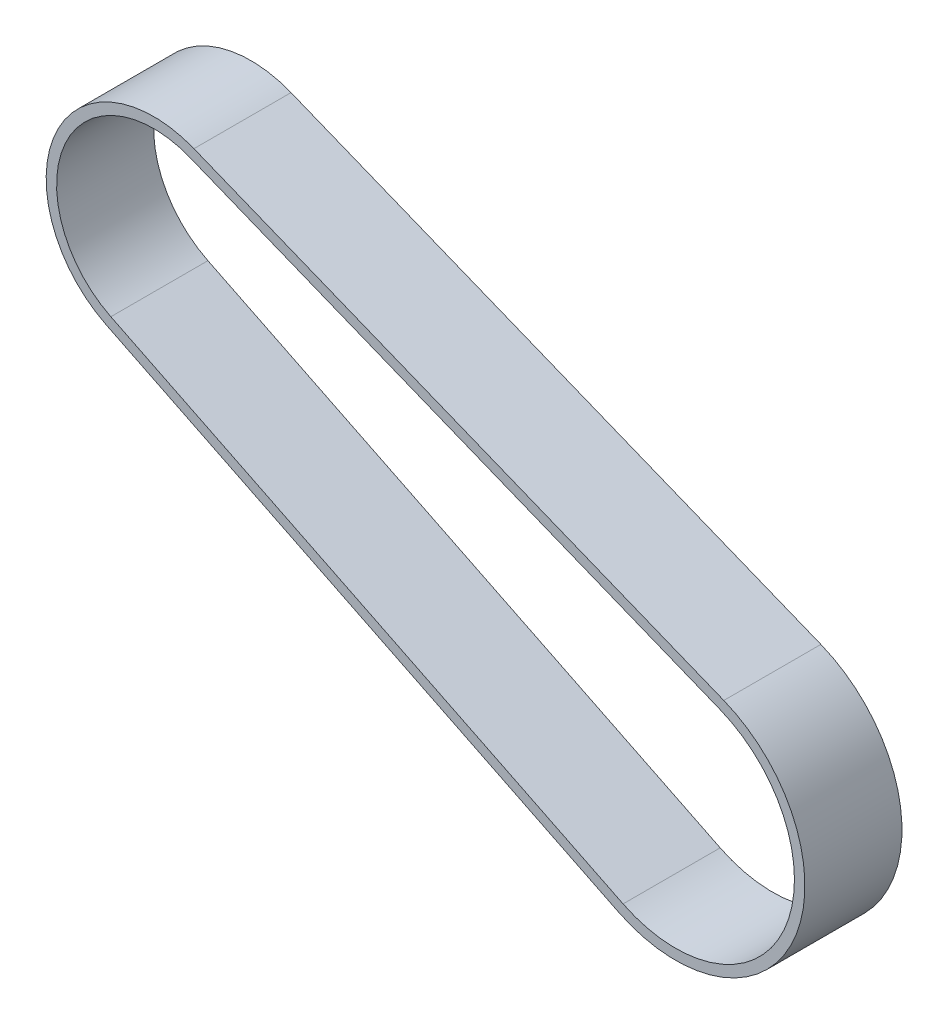
ISO-10303-21;
HEADER;
FILE_DESCRIPTION(('STEP AP214'),'2;1');
FILE_NAME('part.step','',(''),(''),'','','');
FILE_SCHEMA(('AUTOMOTIVE_DESIGN { 1 0 10303 214 1 1 1 1 }'));
ENDSEC;
DATA;
#1=APPLICATION_CONTEXT('core data for automotive mechanical design processes');
#2=APPLICATION_PROTOCOL_DEFINITION('international standard','automotive_design',2000,#1);
#3=PRODUCT_CONTEXT('',#1,'mechanical');
#4=PRODUCT('Part','Part','',(#3));
#5=PRODUCT_RELATED_PRODUCT_CATEGORY('part','',(#4));
#6=PRODUCT_DEFINITION_FORMATION('','',#4);
#7=PRODUCT_DEFINITION_CONTEXT('part definition',#1,'design');
#8=PRODUCT_DEFINITION('design','',#6,#7);
#9=PRODUCT_DEFINITION_SHAPE('','',#8);
#10=(LENGTH_UNIT() NAMED_UNIT(*) SI_UNIT(.MILLI.,.METRE.));
#11=(NAMED_UNIT(*) PLANE_ANGLE_UNIT() SI_UNIT($,.RADIAN.));
#12=(NAMED_UNIT(*) SI_UNIT($,.STERADIAN.) SOLID_ANGLE_UNIT());
#13=UNCERTAINTY_MEASURE_WITH_UNIT(LENGTH_MEASURE(1.E-05),#10,'distance_accuracy_value','');
#14=(GEOMETRIC_REPRESENTATION_CONTEXT(3) GLOBAL_UNCERTAINTY_ASSIGNED_CONTEXT((#13)) GLOBAL_UNIT_ASSIGNED_CONTEXT((#10,
#11,#12)) REPRESENTATION_CONTEXT('',''));
#15=CARTESIAN_POINT('',(0.,0.,0.));
#16=DIRECTION('',(0.,0.,1.));
#17=DIRECTION('',(1.,0.,0.));
#18=AXIS2_PLACEMENT_3D('',#15,#16,#17);
#19=CARTESIAN_POINT('',(0.,0.,40.));
#20=DIRECTION('',(0.,0.,1.));
#21=DIRECTION('',(1.,0.,0.));
#22=AXIS2_PLACEMENT_3D('',#19,#20,#21);
#23=PLANE('',#22);
#24=CARTESIAN_POINT('',(0.,0.,40.));
#25=DIRECTION('',(0.,0.,1.));
#26=DIRECTION('',(1.,0.,0.));
#27=AXIS2_PLACEMENT_3D('',#24,#25,#26);
#28=CIRCLE('',#27,44.355);
#29=CARTESIAN_POINT('',(16.537669035801,41.1566705147818,40.));
#30=VERTEX_POINT('',#29);
#31=CARTESIAN_POINT('',(-19.6028811565883,-39.7881021834502,40.));
#32=VERTEX_POINT('',#31);
#33=EDGE_CURVE('E133',#30,#32,#28,.T.);
#34=ORIENTED_EDGE('',*,*,#33,.T.);
#35=DIRECTION('',(0.897037587272015,-0.441954258969412,0.));
#36=VECTOR('',#35,1.);
#37=CARTESIAN_POINT('',(-19.6028811565883,-39.7881021834502,40.));
#38=LINE('',#37,#36);
#39=CARTESIAN_POINT('',(191.46231159785,-143.776120279439,40.));
#40=VERTEX_POINT('',#39);
#41=EDGE_CURVE('E136',#32,#40,#38,.T.);
#42=ORIENTED_EDGE('',*,*,#41,.T.);
#43=CARTESIAN_POINT('',(215.003005201856,-95.9954131933949,40.));
#44=DIRECTION('',(0.,0.,1.));
#45=DIRECTION('',(1.,0.,0.));
#46=AXIS2_PLACEMENT_3D('',#43,#44,#45);
#47=CIRCLE('',#46,53.265);
#48=CARTESIAN_POINT('',(234.862749113297,-46.5712207693197,40.));
#49=VERTEX_POINT('',#48);
#50=EDGE_CURVE('E139',#40,#49,#47,.T.);
#51=ORIENTED_EDGE('',*,*,#50,.T.);
#52=DIRECTION('',(-0.927892470178826,0.372847909723841,0.));
#53=VECTOR('',#52,1.);
#54=CARTESIAN_POINT('',(234.862749113297,-46.5712207693197,40.));
#55=LINE('',#54,#53);
#56=EDGE_CURVE('E141',#49,#30,#55,.T.);
#57=ORIENTED_EDGE('',*,*,#56,.T.);
#58=EDGE_LOOP('',(#34,#42,#51,#57));
#59=FACE_BOUND('',#58,.T.);
#60=DIRECTION('',(-0.927892470178826,0.372847909723841,0.));
#61=VECTOR('',#60,1.);
#62=CARTESIAN_POINT('',(14.9344230239884,37.1667328930128,40.));
#63=LINE('',#62,#61);
#64=CARTESIAN_POINT('',(233.259503101484,-50.5611583910887,40.));
#65=VERTEX_POINT('',#64);
#66=CARTESIAN_POINT('',(14.9344230239884,37.1667328930128,40.));
#67=VERTEX_POINT('',#66);
#68=EDGE_CURVE('E105',#65,#67,#63,.T.);
#69=ORIENTED_EDGE('',*,*,#68,.F.);
#70=CARTESIAN_POINT('',(215.003005201856,-95.9954131933949,40.));
#71=DIRECTION('',(0.,0.,1.));
#72=DIRECTION('',(-1.,0.,0.));
#73=AXIS2_PLACEMENT_3D('',#70,#71,#72);
#74=CIRCLE('',#73,48.965);
#75=CARTESIAN_POINT('',(193.362714911419,-139.918858654169,40.));
#76=VERTEX_POINT('',#75);
#77=EDGE_CURVE('E97',#76,#65,#74,.T.);
#78=ORIENTED_EDGE('',*,*,#77,.F.);
#79=DIRECTION('',(0.897037587272015,-0.441954258969413,0.));
#80=VECTOR('',#79,1.);
#81=CARTESIAN_POINT('',(193.362714911419,-139.918858654169,40.));
#82=LINE('',#81,#80);
#83=CARTESIAN_POINT('',(-17.7024778430198,-35.9308405581806,40.));
#84=VERTEX_POINT('',#83);
#85=EDGE_CURVE('E119',#84,#76,#82,.T.);
#86=ORIENTED_EDGE('',*,*,#85,.F.);
#87=CARTESIAN_POINT('',(0.,0.,40.));
#88=DIRECTION('',(0.,0.,1.));
#89=DIRECTION('',(-1.,0.,0.));
#90=AXIS2_PLACEMENT_3D('',#87,#88,#89);
#91=CIRCLE('',#90,40.055);
#92=EDGE_CURVE('E117',#67,#84,#91,.T.);
#93=ORIENTED_EDGE('',*,*,#92,.F.);
#94=EDGE_LOOP('',(#69,#78,#86,#93));
#95=FACE_BOUND('',#94,.T.);
#96=ADVANCED_FACE('F32',(#59,#95),#23,.T.);
#97=CARTESIAN_POINT('',(0.,0.,0.));
#98=DIRECTION('',(0.,0.,1.));
#99=DIRECTION('',(1.,0.,0.));
#100=AXIS2_PLACEMENT_3D('',#97,#98,#99);
#101=PLANE('',#100);
#102=CARTESIAN_POINT('',(0.,0.,0.));
#103=DIRECTION('',(0.,0.,1.));
#104=DIRECTION('',(1.,0.,0.));
#105=AXIS2_PLACEMENT_3D('',#102,#103,#104);
#106=CIRCLE('',#105,44.355);
#107=CARTESIAN_POINT('',(16.537669035801,41.1566705147818,0.));
#108=VERTEX_POINT('',#107);
#109=CARTESIAN_POINT('',(-19.6028811565883,-39.7881021834502,0.));
#110=VERTEX_POINT('',#109);
#111=EDGE_CURVE('E113',#108,#110,#106,.T.);
#112=ORIENTED_EDGE('',*,*,#111,.F.);
#113=DIRECTION('',(-0.927892470178826,0.372847909723841,0.));
#114=VECTOR('',#113,1.);
#115=CARTESIAN_POINT('',(234.862749113297,-46.5712207693197,0.));
#116=LINE('',#115,#114);
#117=CARTESIAN_POINT('',(234.862749113297,-46.5712207693197,0.));
#118=VERTEX_POINT('',#117);
#119=EDGE_CURVE('E137',#118,#108,#116,.T.);
#120=ORIENTED_EDGE('',*,*,#119,.F.);
#121=CARTESIAN_POINT('',(215.003005201856,-95.9954131933949,0.));
#122=DIRECTION('',(0.,0.,1.));
#123=DIRECTION('',(1.,0.,0.));
#124=AXIS2_PLACEMENT_3D('',#121,#122,#123);
#125=CIRCLE('',#124,53.265);
#126=CARTESIAN_POINT('',(191.46231159785,-143.776120279439,0.));
#127=VERTEX_POINT('',#126);
#128=EDGE_CURVE('E148',#127,#118,#125,.T.);
#129=ORIENTED_EDGE('',*,*,#128,.F.);
#130=DIRECTION('',(0.897037587272015,-0.441954258969412,0.));
#131=VECTOR('',#130,1.);
#132=CARTESIAN_POINT('',(-19.6028811565883,-39.7881021834502,0.));
#133=LINE('',#132,#131);
#134=EDGE_CURVE('E146',#110,#127,#133,.T.);
#135=ORIENTED_EDGE('',*,*,#134,.F.);
#136=EDGE_LOOP('',(#112,#120,#129,#135));
#137=FACE_BOUND('',#136,.T.);
#138=CARTESIAN_POINT('',(215.003005201856,-95.9954131933949,0.));
#139=DIRECTION('',(0.,0.,1.));
#140=DIRECTION('',(-1.,0.,0.));
#141=AXIS2_PLACEMENT_3D('',#138,#139,#140);
#142=CIRCLE('',#141,48.965);
#143=CARTESIAN_POINT('',(193.362714911419,-139.918858654169,0.));
#144=VERTEX_POINT('',#143);
#145=CARTESIAN_POINT('',(233.259503101484,-50.5611583910887,0.));
#146=VERTEX_POINT('',#145);
#147=EDGE_CURVE('E55',#144,#146,#142,.T.);
#148=ORIENTED_EDGE('',*,*,#147,.T.);
#149=DIRECTION('',(-0.927892470178826,0.372847909723841,0.));
#150=VECTOR('',#149,1.);
#151=CARTESIAN_POINT('',(14.9344230239884,37.1667328930128,0.));
#152=LINE('',#151,#150);
#153=CARTESIAN_POINT('',(14.9344230239884,37.1667328930128,0.));
#154=VERTEX_POINT('',#153);
#155=EDGE_CURVE('E112',#146,#154,#152,.T.);
#156=ORIENTED_EDGE('',*,*,#155,.T.);
#157=CARTESIAN_POINT('',(0.,0.,0.));
#158=DIRECTION('',(0.,0.,1.));
#159=DIRECTION('',(-1.,0.,0.));
#160=AXIS2_PLACEMENT_3D('',#157,#158,#159);
#161=CIRCLE('',#160,40.055);
#162=CARTESIAN_POINT('',(-17.7024778430198,-35.9308405581805,0.));
#163=VERTEX_POINT('',#162);
#164=EDGE_CURVE('E125',#154,#163,#161,.T.);
#165=ORIENTED_EDGE('',*,*,#164,.T.);
#166=DIRECTION('',(0.897037587272015,-0.441954258969413,0.));
#167=VECTOR('',#166,1.);
#168=CARTESIAN_POINT('',(193.362714911419,-139.918858654169,0.));
#169=LINE('',#168,#167);
#170=EDGE_CURVE('E106',#163,#144,#169,.T.);
#171=ORIENTED_EDGE('',*,*,#170,.T.);
#172=EDGE_LOOP('',(#148,#156,#165,#171));
#173=FACE_BOUND('',#172,.T.);
#174=ADVANCED_FACE('F166',(#137,#173),#101,.F.);
#175=CARTESIAN_POINT('',(0.,0.,40.));
#176=DIRECTION('',(0.,0.,-1.));
#177=DIRECTION('',(-1.,0.,0.));
#178=AXIS2_PLACEMENT_3D('',#175,#176,#177);
#179=CYLINDRICAL_SURFACE('',#178,44.355);
#180=ORIENTED_EDGE('',*,*,#111,.T.);
#181=DIRECTION('',(0.,0.,-1.));
#182=VECTOR('',#181,1.);
#183=CARTESIAN_POINT('',(-19.6028811565883,-39.7881021834502,40.));
#184=LINE('',#183,#182);
#185=EDGE_CURVE('E11',#32,#110,#184,.T.);
#186=ORIENTED_EDGE('',*,*,#185,.F.);
#187=ORIENTED_EDGE('',*,*,#33,.F.);
#188=DIRECTION('',(0.,0.,-1.));
#189=VECTOR('',#188,1.);
#190=CARTESIAN_POINT('',(16.537669035801,41.1566705147818,40.));
#191=LINE('',#190,#189);
#192=EDGE_CURVE('E143',#30,#108,#191,.T.);
#193=ORIENTED_EDGE('',*,*,#192,.T.);
#194=EDGE_LOOP('',(#180,#186,#187,#193));
#195=FACE_BOUND('',#194,.T.);
#196=ADVANCED_FACE('F34',(#195),#179,.T.);
#197=CARTESIAN_POINT('',(-19.6028811565883,-39.7881021834502,40.));
#198=DIRECTION('',(0.441954258969412,0.897037587272015,0.));
#199=DIRECTION('',(-0.897037587272015,0.441954258969412,0.));
#200=AXIS2_PLACEMENT_3D('',#197,#198,#199);
#201=PLANE('',#200);
#202=ORIENTED_EDGE('',*,*,#134,.T.);
#203=DIRECTION('',(0.,0.,-1.));
#204=VECTOR('',#203,1.);
#205=CARTESIAN_POINT('',(191.46231159785,-143.776120279439,40.));
#206=LINE('',#205,#204);
#207=EDGE_CURVE('E40',#40,#127,#206,.T.);
#208=ORIENTED_EDGE('',*,*,#207,.F.);
#209=ORIENTED_EDGE('',*,*,#41,.F.);
#210=ORIENTED_EDGE('',*,*,#185,.T.);
#211=EDGE_LOOP('',(#202,#208,#209,#210));
#212=FACE_BOUND('',#211,.T.);
#213=ADVANCED_FACE('F176',(#212),#201,.F.);
#214=CARTESIAN_POINT('',(215.003005201856,-95.9954131933949,40.));
#215=DIRECTION('',(0.,0.,-1.));
#216=DIRECTION('',(-1.,0.,0.));
#217=AXIS2_PLACEMENT_3D('',#214,#215,#216);
#218=CYLINDRICAL_SURFACE('',#217,53.265);
#219=ORIENTED_EDGE('',*,*,#128,.T.);
#220=DIRECTION('',(0.,0.,-1.));
#221=VECTOR('',#220,1.);
#222=CARTESIAN_POINT('',(234.862749113297,-46.5712207693197,40.));
#223=LINE('',#222,#221);
#224=EDGE_CURVE('E153',#49,#118,#223,.T.);
#225=ORIENTED_EDGE('',*,*,#224,.F.);
#226=ORIENTED_EDGE('',*,*,#50,.F.);
#227=ORIENTED_EDGE('',*,*,#207,.T.);
#228=EDGE_LOOP('',(#219,#225,#226,#227));
#229=FACE_BOUND('',#228,.T.);
#230=ADVANCED_FACE('F160',(#229),#218,.T.);
#231=CARTESIAN_POINT('',(234.862749113297,-46.5712207693197,40.));
#232=DIRECTION('',(-0.372847909723841,-0.927892470178826,0.));
#233=DIRECTION('',(0.927892470178826,-0.372847909723841,0.));
#234=AXIS2_PLACEMENT_3D('',#231,#232,#233);
#235=PLANE('',#234);
#236=ORIENTED_EDGE('',*,*,#119,.T.);
#237=ORIENTED_EDGE('',*,*,#192,.F.);
#238=ORIENTED_EDGE('',*,*,#56,.F.);
#239=ORIENTED_EDGE('',*,*,#224,.T.);
#240=EDGE_LOOP('',(#236,#237,#238,#239));
#241=FACE_BOUND('',#240,.T.);
#242=ADVANCED_FACE('F170',(#241),#235,.F.);
#243=CARTESIAN_POINT('',(215.003005201856,-95.9954131933949,40.));
#244=DIRECTION('',(0.,0.,-1.));
#245=DIRECTION('',(-1.,0.,0.));
#246=AXIS2_PLACEMENT_3D('',#243,#244,#245);
#247=CYLINDRICAL_SURFACE('',#246,48.965);
#248=ORIENTED_EDGE('',*,*,#147,.F.);
#249=DIRECTION('',(0.,0.,-1.));
#250=VECTOR('',#249,1.);
#251=CARTESIAN_POINT('',(193.362714911419,-139.918858654169,40.));
#252=LINE('',#251,#250);
#253=EDGE_CURVE('E101',#76,#144,#252,.T.);
#254=ORIENTED_EDGE('',*,*,#253,.F.);
#255=ORIENTED_EDGE('',*,*,#77,.T.);
#256=DIRECTION('',(0.,0.,-1.));
#257=VECTOR('',#256,1.);
#258=CARTESIAN_POINT('',(233.259503101484,-50.5611583910887,40.));
#259=LINE('',#258,#257);
#260=EDGE_CURVE('E100',#65,#146,#259,.T.);
#261=ORIENTED_EDGE('',*,*,#260,.T.);
#262=EDGE_LOOP('',(#248,#254,#255,#261));
#263=FACE_BOUND('',#262,.T.);
#264=ADVANCED_FACE('F99',(#263),#247,.F.);
#265=CARTESIAN_POINT('',(14.9344230239884,37.1667328930128,40.));
#266=DIRECTION('',(-0.372847909723841,-0.927892470178826,0.));
#267=DIRECTION('',(0.927892470178826,-0.372847909723841,0.));
#268=AXIS2_PLACEMENT_3D('',#265,#266,#267);
#269=PLANE('',#268);
#270=ORIENTED_EDGE('',*,*,#155,.F.);
#271=ORIENTED_EDGE('',*,*,#260,.F.);
#272=ORIENTED_EDGE('',*,*,#68,.T.);
#273=DIRECTION('',(0.,0.,-1.));
#274=VECTOR('',#273,1.);
#275=CARTESIAN_POINT('',(14.9344230239884,37.1667328930128,40.));
#276=LINE('',#275,#274);
#277=EDGE_CURVE('E114',#67,#154,#276,.T.);
#278=ORIENTED_EDGE('',*,*,#277,.T.);
#279=EDGE_LOOP('',(#270,#271,#272,#278));
#280=FACE_BOUND('',#279,.T.);
#281=ADVANCED_FACE('F109',(#280),#269,.T.);
#282=CARTESIAN_POINT('',(0.,0.,40.));
#283=DIRECTION('',(0.,0.,-1.));
#284=DIRECTION('',(-1.,0.,0.));
#285=AXIS2_PLACEMENT_3D('',#282,#283,#284);
#286=CYLINDRICAL_SURFACE('',#285,40.055);
#287=ORIENTED_EDGE('',*,*,#164,.F.);
#288=ORIENTED_EDGE('',*,*,#277,.F.);
#289=ORIENTED_EDGE('',*,*,#92,.T.);
#290=DIRECTION('',(0.,0.,-1.));
#291=VECTOR('',#290,1.);
#292=CARTESIAN_POINT('',(-17.7024778430198,-35.9308405581805,40.));
#293=LINE('',#292,#291);
#294=EDGE_CURVE('E47',#84,#163,#293,.T.);
#295=ORIENTED_EDGE('',*,*,#294,.T.);
#296=EDGE_LOOP('',(#287,#288,#289,#295));
#297=FACE_BOUND('',#296,.T.);
#298=ADVANCED_FACE('F199',(#297),#286,.F.);
#299=CARTESIAN_POINT('',(193.362714911419,-139.918858654169,40.));
#300=DIRECTION('',(0.441954258969413,0.897037587272015,0.));
#301=DIRECTION('',(-0.897037587272015,0.441954258969412,0.));
#302=AXIS2_PLACEMENT_3D('',#299,#300,#301);
#303=PLANE('',#302);
#304=ORIENTED_EDGE('',*,*,#170,.F.);
#305=ORIENTED_EDGE('',*,*,#294,.F.);
#306=ORIENTED_EDGE('',*,*,#85,.T.);
#307=ORIENTED_EDGE('',*,*,#253,.T.);
#308=EDGE_LOOP('',(#304,#305,#306,#307));
#309=FACE_BOUND('',#308,.T.);
#310=ADVANCED_FACE('F203',(#309),#303,.T.);
#311=CLOSED_SHELL('',(#96,#174,#196,#213,#230,#242,#264,#281,#298,#310));
#312=MANIFOLD_SOLID_BREP('B2',#311);
#313=ADVANCED_BREP_SHAPE_REPRESENTATION('',(#18,#312),#14);
#314=SHAPE_DEFINITION_REPRESENTATION(#9,#313);
ENDSEC;
END-ISO-10303-21;
